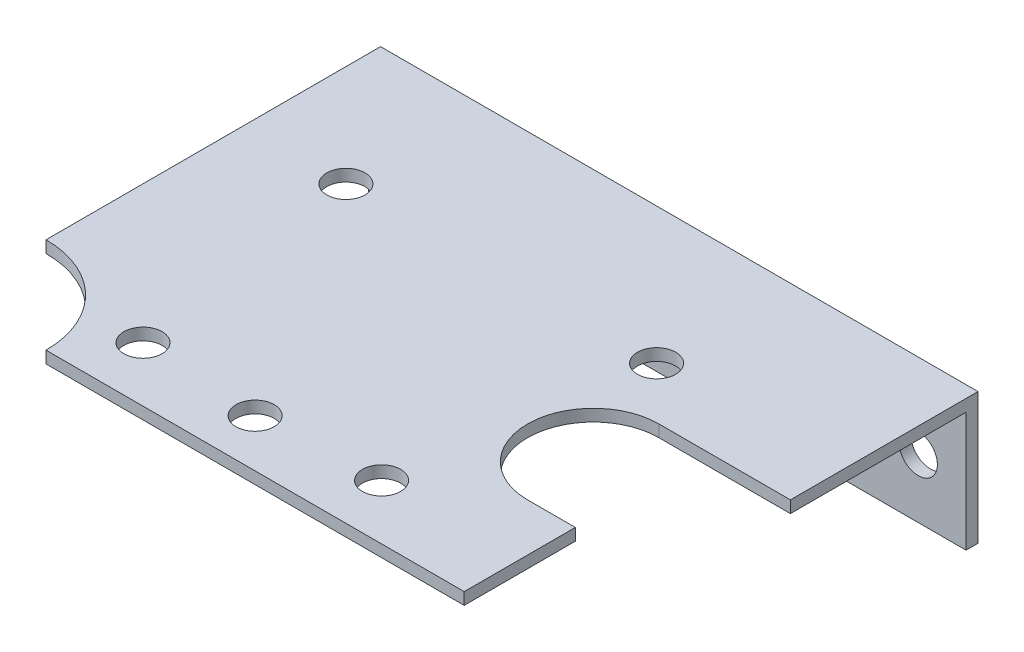
ISO-10303-21;
HEADER;
FILE_DESCRIPTION(('STEP AP214'),'2;1');
FILE_NAME('part.step','',(''),(''),'','','');
FILE_SCHEMA(('AUTOMOTIVE_DESIGN { 1 0 10303 214 1 1 1 1 }'));
ENDSEC;
DATA;
#1=APPLICATION_CONTEXT('core data for automotive mechanical design processes');
#2=APPLICATION_PROTOCOL_DEFINITION('international standard','automotive_design',2000,#1);
#3=PRODUCT_CONTEXT('',#1,'mechanical');
#4=PRODUCT('Part','Part','',(#3));
#5=PRODUCT_RELATED_PRODUCT_CATEGORY('part','',(#4));
#6=PRODUCT_DEFINITION_FORMATION('','',#4);
#7=PRODUCT_DEFINITION_CONTEXT('part definition',#1,'design');
#8=PRODUCT_DEFINITION('design','',#6,#7);
#9=PRODUCT_DEFINITION_SHAPE('','',#8);
#10=(LENGTH_UNIT() NAMED_UNIT(*) SI_UNIT(.MILLI.,.METRE.));
#11=(NAMED_UNIT(*) PLANE_ANGLE_UNIT() SI_UNIT($,.RADIAN.));
#12=(NAMED_UNIT(*) SI_UNIT($,.STERADIAN.) SOLID_ANGLE_UNIT());
#13=UNCERTAINTY_MEASURE_WITH_UNIT(LENGTH_MEASURE(1.E-05),#10,'distance_accuracy_value','');
#14=(GEOMETRIC_REPRESENTATION_CONTEXT(3) GLOBAL_UNCERTAINTY_ASSIGNED_CONTEXT((#13)) GLOBAL_UNIT_ASSIGNED_CONTEXT((#10,
#11,#12)) REPRESENTATION_CONTEXT('',''));
#15=CARTESIAN_POINT('',(0.,0.,0.));
#16=DIRECTION('',(0.,0.,1.));
#17=DIRECTION('',(1.,0.,0.));
#18=AXIS2_PLACEMENT_3D('',#15,#16,#17);
#19=CARTESIAN_POINT('',(0.,1.,0.));
#20=DIRECTION('',(0.,1.,0.));
#21=DIRECTION('',(0.,0.,1.));
#22=AXIS2_PLACEMENT_3D('',#19,#20,#21);
#23=PLANE('',#22);
#24=DIRECTION('',(0.,0.,-1.));
#25=VECTOR('',#24,1.);
#26=CARTESIAN_POINT('',(50.,1.,-20.3));
#27=LINE('',#26,#25);
#28=CARTESIAN_POINT('',(50.,1.,-20.3));
#29=VERTEX_POINT('',#28);
#30=CARTESIAN_POINT('',(50.,1.,-36.));
#31=VERTEX_POINT('',#30);
#32=EDGE_CURVE('E95',#29,#31,#27,.T.);
#33=ORIENTED_EDGE('',*,*,#32,.T.);
#34=DIRECTION('',(-1.,0.,0.));
#35=VECTOR('',#34,1.);
#36=CARTESIAN_POINT('',(0.,1.,-36.));
#37=LINE('',#36,#35);
#38=CARTESIAN_POINT('',(0.,1.,-36.));
#39=VERTEX_POINT('',#38);
#40=EDGE_CURVE('E237',#31,#39,#37,.T.);
#41=ORIENTED_EDGE('',*,*,#40,.T.);
#42=DIRECTION('',(0.,0.,1.));
#43=VECTOR('',#42,1.);
#44=CARTESIAN_POINT('',(0.,1.,-8.));
#45=LINE('',#44,#43);
#46=CARTESIAN_POINT('',(0.,1.,-8.));
#47=VERTEX_POINT('',#46);
#48=EDGE_CURVE('E181',#39,#47,#45,.T.);
#49=ORIENTED_EDGE('',*,*,#48,.T.);
#50=CARTESIAN_POINT('',(0.,1.,0.));
#51=DIRECTION('',(0.,-1.,0.));
#52=DIRECTION('',(0.,0.,1.));
#53=AXIS2_PLACEMENT_3D('',#50,#51,#52);
#54=CIRCLE('',#53,8.);
#55=CARTESIAN_POINT('',(8.,1.,0.));
#56=VERTEX_POINT('',#55);
#57=EDGE_CURVE('E240',#47,#56,#54,.T.);
#58=ORIENTED_EDGE('',*,*,#57,.T.);
#59=DIRECTION('',(1.,0.,0.));
#60=VECTOR('',#59,1.);
#61=CARTESIAN_POINT('',(8.,1.,0.));
#62=LINE('',#61,#60);
#63=CARTESIAN_POINT('',(43.,1.,0.));
#64=VERTEX_POINT('',#63);
#65=EDGE_CURVE('E242',#56,#64,#62,.T.);
#66=ORIENTED_EDGE('',*,*,#65,.T.);
#67=DIRECTION('',(0.,0.,-1.));
#68=VECTOR('',#67,1.);
#69=CARTESIAN_POINT('',(43.,1.,0.));
#70=LINE('',#69,#68);
#71=CARTESIAN_POINT('',(43.,1.,-9.3));
#72=VERTEX_POINT('',#71);
#73=EDGE_CURVE('E121',#64,#72,#70,.T.);
#74=ORIENTED_EDGE('',*,*,#73,.T.);
#75=DIRECTION('',(-1.,0.,0.));
#76=VECTOR('',#75,1.);
#77=CARTESIAN_POINT('',(39.,1.,-9.3));
#78=LINE('',#77,#76);
#79=CARTESIAN_POINT('',(39.,1.,-9.3));
#80=VERTEX_POINT('',#79);
#81=EDGE_CURVE('E114',#72,#80,#78,.T.);
#82=ORIENTED_EDGE('',*,*,#81,.T.);
#83=CARTESIAN_POINT('',(39.,1.,-14.8));
#84=DIRECTION('',(0.,-1.,0.));
#85=DIRECTION('',(0.,0.,-1.));
#86=AXIS2_PLACEMENT_3D('',#83,#84,#85);
#87=CIRCLE('',#86,5.5);
#88=CARTESIAN_POINT('',(39.,1.,-20.3));
#89=VERTEX_POINT('',#88);
#90=EDGE_CURVE('E118',#80,#89,#87,.T.);
#91=ORIENTED_EDGE('',*,*,#90,.T.);
#92=DIRECTION('',(1.,0.,0.));
#93=VECTOR('',#92,1.);
#94=CARTESIAN_POINT('',(39.,1.,-20.3));
#95=LINE('',#94,#93);
#96=EDGE_CURVE('E59',#89,#29,#95,.T.);
#97=ORIENTED_EDGE('',*,*,#96,.T.);
#98=EDGE_LOOP('',(#33,#41,#49,#58,#66,#74,#82,#91,#97));
#99=FACE_BOUND('',#98,.T.);
#100=CARTESIAN_POINT('',(31.4819837707742,1.,-4.6));
#101=DIRECTION('',(0.,1.,0.));
#102=DIRECTION('',(0.,0.,1.));
#103=AXIS2_PLACEMENT_3D('',#100,#101,#102);
#104=CIRCLE('',#103,1.60000000000001);
#105=CARTESIAN_POINT('',(31.4819837707742,1.,-2.99999999999998));
#106=VERTEX_POINT('',#105);
#107=EDGE_CURVE('E214',#106,#106,#104,.T.);
#108=ORIENTED_EDGE('',*,*,#107,.F.);
#109=EDGE_LOOP('',(#108));
#110=FACE_BOUND('',#109,.T.);
#111=CARTESIAN_POINT('',(21.5,1.,-4.));
#112=DIRECTION('',(0.,1.,0.));
#113=DIRECTION('',(0.,0.,1.));
#114=AXIS2_PLACEMENT_3D('',#111,#112,#113);
#115=CIRCLE('',#114,1.6);
#116=CARTESIAN_POINT('',(21.5,1.,-2.4));
#117=VERTEX_POINT('',#116);
#118=EDGE_CURVE('E226',#117,#117,#115,.T.);
#119=ORIENTED_EDGE('',*,*,#118,.F.);
#120=EDGE_LOOP('',(#119));
#121=FACE_BOUND('',#120,.T.);
#122=CARTESIAN_POINT('',(8.5,1.,-24.6));
#123=DIRECTION('',(0.,1.,0.));
#124=DIRECTION('',(0.,0.,1.));
#125=AXIS2_PLACEMENT_3D('',#122,#123,#124);
#126=CIRCLE('',#125,1.6);
#127=CARTESIAN_POINT('',(8.5,1.,-23.));
#128=VERTEX_POINT('',#127);
#129=EDGE_CURVE('E146',#128,#128,#126,.T.);
#130=ORIENTED_EDGE('',*,*,#129,.F.);
#131=EDGE_LOOP('',(#130));
#132=FACE_BOUND('',#131,.T.);
#133=CARTESIAN_POINT('',(34.5,1.,-24.6));
#134=DIRECTION('',(0.,1.,0.));
#135=DIRECTION('',(0.,0.,-1.));
#136=AXIS2_PLACEMENT_3D('',#133,#134,#135);
#137=CIRCLE('',#136,1.6);
#138=CARTESIAN_POINT('',(34.5,1.,-26.2));
#139=VERTEX_POINT('',#138);
#140=EDGE_CURVE('E220',#139,#139,#137,.T.);
#141=ORIENTED_EDGE('',*,*,#140,.F.);
#142=EDGE_LOOP('',(#141));
#143=FACE_BOUND('',#142,.T.);
#144=CARTESIAN_POINT('',(11.5180162292258,1.,-4.59999999999999));
#145=DIRECTION('',(0.,1.,0.));
#146=DIRECTION('',(0.,0.,-1.));
#147=AXIS2_PLACEMENT_3D('',#144,#145,#146);
#148=CIRCLE('',#147,1.6);
#149=CARTESIAN_POINT('',(11.5180162292258,1.,-6.2));
#150=VERTEX_POINT('',#149);
#151=EDGE_CURVE('E208',#150,#150,#148,.T.);
#152=ORIENTED_EDGE('',*,*,#151,.F.);
#153=EDGE_LOOP('',(#152));
#154=FACE_BOUND('',#153,.T.);
#155=ADVANCED_FACE('F35',(#99,#110,#121,#132,#143,#154),#23,.T.);
#156=CARTESIAN_POINT('',(0.,0.,0.));
#157=DIRECTION('',(0.,1.,0.));
#158=DIRECTION('',(0.,0.,1.));
#159=AXIS2_PLACEMENT_3D('',#156,#157,#158);
#160=PLANE('',#159);
#161=DIRECTION('',(0.,0.,1.));
#162=VECTOR('',#161,1.);
#163=CARTESIAN_POINT('',(0.,0.,-8.));
#164=LINE('',#163,#162);
#165=CARTESIAN_POINT('',(0.,0.,-35.));
#166=VERTEX_POINT('',#165);
#167=CARTESIAN_POINT('',(0.,0.,-8.));
#168=VERTEX_POINT('',#167);
#169=EDGE_CURVE('E145',#166,#168,#164,.T.);
#170=ORIENTED_EDGE('',*,*,#169,.F.);
#171=DIRECTION('',(1.,0.,0.));
#172=VECTOR('',#171,1.);
#173=CARTESIAN_POINT('',(0.,0.,-35.));
#174=LINE('',#173,#172);
#175=CARTESIAN_POINT('',(50.,0.,-35.));
#176=VERTEX_POINT('',#175);
#177=EDGE_CURVE('E204',#166,#176,#174,.T.);
#178=ORIENTED_EDGE('',*,*,#177,.T.);
#179=DIRECTION('',(0.,0.,-1.));
#180=VECTOR('',#179,1.);
#181=CARTESIAN_POINT('',(50.,0.,-20.3));
#182=LINE('',#181,#180);
#183=CARTESIAN_POINT('',(50.,0.,-20.3));
#184=VERTEX_POINT('',#183);
#185=EDGE_CURVE('E142',#184,#176,#182,.T.);
#186=ORIENTED_EDGE('',*,*,#185,.F.);
#187=DIRECTION('',(1.,0.,0.));
#188=VECTOR('',#187,1.);
#189=CARTESIAN_POINT('',(39.,0.,-20.3));
#190=LINE('',#189,#188);
#191=CARTESIAN_POINT('',(39.,0.,-20.3));
#192=VERTEX_POINT('',#191);
#193=EDGE_CURVE('E89',#192,#184,#190,.T.);
#194=ORIENTED_EDGE('',*,*,#193,.F.);
#195=CARTESIAN_POINT('',(39.,0.,-14.8));
#196=DIRECTION('',(0.,-1.,0.));
#197=DIRECTION('',(0.,0.,-1.));
#198=AXIS2_PLACEMENT_3D('',#195,#196,#197);
#199=CIRCLE('',#198,5.5);
#200=CARTESIAN_POINT('',(39.,0.,-9.3));
#201=VERTEX_POINT('',#200);
#202=EDGE_CURVE('E155',#201,#192,#199,.T.);
#203=ORIENTED_EDGE('',*,*,#202,.F.);
#204=DIRECTION('',(-1.,0.,0.));
#205=VECTOR('',#204,1.);
#206=CARTESIAN_POINT('',(39.,0.,-9.3));
#207=LINE('',#206,#205);
#208=CARTESIAN_POINT('',(43.,0.,-9.3));
#209=VERTEX_POINT('',#208);
#210=EDGE_CURVE('E130',#209,#201,#207,.T.);
#211=ORIENTED_EDGE('',*,*,#210,.F.);
#212=DIRECTION('',(0.,0.,-1.));
#213=VECTOR('',#212,1.);
#214=CARTESIAN_POINT('',(43.,0.,0.));
#215=LINE('',#214,#213);
#216=CARTESIAN_POINT('',(43.,0.,0.));
#217=VERTEX_POINT('',#216);
#218=EDGE_CURVE('E152',#217,#209,#215,.T.);
#219=ORIENTED_EDGE('',*,*,#218,.F.);
#220=DIRECTION('',(1.,0.,0.));
#221=VECTOR('',#220,1.);
#222=CARTESIAN_POINT('',(8.,0.,0.));
#223=LINE('',#222,#221);
#224=CARTESIAN_POINT('',(8.,0.,0.));
#225=VERTEX_POINT('',#224);
#226=EDGE_CURVE('E150',#225,#217,#223,.T.);
#227=ORIENTED_EDGE('',*,*,#226,.F.);
#228=CARTESIAN_POINT('',(0.,0.,0.));
#229=DIRECTION('',(0.,-1.,0.));
#230=DIRECTION('',(0.,0.,1.));
#231=AXIS2_PLACEMENT_3D('',#228,#229,#230);
#232=CIRCLE('',#231,8.);
#233=EDGE_CURVE('E148',#168,#225,#232,.T.);
#234=ORIENTED_EDGE('',*,*,#233,.F.);
#235=EDGE_LOOP('',(#170,#178,#186,#194,#203,#211,#219,#227,#234));
#236=FACE_BOUND('',#235,.T.);
#237=CARTESIAN_POINT('',(8.5,0.,-24.6));
#238=DIRECTION('',(0.,1.,0.));
#239=DIRECTION('',(0.,0.,1.));
#240=AXIS2_PLACEMENT_3D('',#237,#238,#239);
#241=CIRCLE('',#240,1.6);
#242=CARTESIAN_POINT('',(8.5,0.,-23.));
#243=VERTEX_POINT('',#242);
#244=EDGE_CURVE('E229',#243,#243,#241,.T.);
#245=ORIENTED_EDGE('',*,*,#244,.T.);
#246=EDGE_LOOP('',(#245));
#247=FACE_BOUND('',#246,.T.);
#248=CARTESIAN_POINT('',(21.5,0.,-4.));
#249=DIRECTION('',(0.,1.,0.));
#250=DIRECTION('',(0.,0.,1.));
#251=AXIS2_PLACEMENT_3D('',#248,#249,#250);
#252=CIRCLE('',#251,1.6);
#253=CARTESIAN_POINT('',(21.5,0.,-2.4));
#254=VERTEX_POINT('',#253);
#255=EDGE_CURVE('E223',#254,#254,#252,.T.);
#256=ORIENTED_EDGE('',*,*,#255,.T.);
#257=EDGE_LOOP('',(#256));
#258=FACE_BOUND('',#257,.T.);
#259=CARTESIAN_POINT('',(34.5,0.,-24.6));
#260=DIRECTION('',(0.,1.,0.));
#261=DIRECTION('',(0.,0.,-1.));
#262=AXIS2_PLACEMENT_3D('',#259,#260,#261);
#263=CIRCLE('',#262,1.6);
#264=CARTESIAN_POINT('',(34.5,0.,-26.2));
#265=VERTEX_POINT('',#264);
#266=EDGE_CURVE('E217',#265,#265,#263,.T.);
#267=ORIENTED_EDGE('',*,*,#266,.T.);
#268=EDGE_LOOP('',(#267));
#269=FACE_BOUND('',#268,.T.);
#270=CARTESIAN_POINT('',(31.4819837707742,0.,-4.6));
#271=DIRECTION('',(0.,1.,0.));
#272=DIRECTION('',(0.,0.,1.));
#273=AXIS2_PLACEMENT_3D('',#270,#271,#272);
#274=CIRCLE('',#273,1.60000000000001);
#275=CARTESIAN_POINT('',(31.4819837707742,0.,-2.99999999999998));
#276=VERTEX_POINT('',#275);
#277=EDGE_CURVE('E211',#276,#276,#274,.T.);
#278=ORIENTED_EDGE('',*,*,#277,.T.);
#279=EDGE_LOOP('',(#278));
#280=FACE_BOUND('',#279,.T.);
#281=CARTESIAN_POINT('',(11.5180162292258,0.,-4.59999999999999));
#282=DIRECTION('',(0.,1.,0.));
#283=DIRECTION('',(0.,0.,-1.));
#284=AXIS2_PLACEMENT_3D('',#281,#282,#283);
#285=CIRCLE('',#284,1.6);
#286=CARTESIAN_POINT('',(11.5180162292258,0.,-6.2));
#287=VERTEX_POINT('',#286);
#288=EDGE_CURVE('E207',#287,#287,#285,.T.);
#289=ORIENTED_EDGE('',*,*,#288,.T.);
#290=EDGE_LOOP('',(#289));
#291=FACE_BOUND('',#290,.T.);
#292=ADVANCED_FACE('F255',(#236,#247,#258,#269,#280,#291),#160,.F.);
#293=CARTESIAN_POINT('',(50.,1.,-20.3));
#294=DIRECTION('',(-1.,0.,0.));
#295=DIRECTION('',(0.,0.,1.));
#296=AXIS2_PLACEMENT_3D('',#293,#294,#295);
#297=PLANE('',#296);
#298=ORIENTED_EDGE('',*,*,#185,.T.);
#299=DIRECTION('',(0.,1.,0.));
#300=VECTOR('',#299,1.);
#301=CARTESIAN_POINT('',(50.,-10.,-35.));
#302=LINE('',#301,#300);
#303=CARTESIAN_POINT('',(50.,-10.,-35.));
#304=VERTEX_POINT('',#303);
#305=EDGE_CURVE('E50',#304,#176,#302,.T.);
#306=ORIENTED_EDGE('',*,*,#305,.F.);
#307=DIRECTION('',(0.,0.,-1.));
#308=VECTOR('',#307,1.);
#309=CARTESIAN_POINT('',(50.,-10.,-36.));
#310=LINE('',#309,#308);
#311=CARTESIAN_POINT('',(50.,-10.,-36.));
#312=VERTEX_POINT('',#311);
#313=EDGE_CURVE('E198',#304,#312,#310,.T.);
#314=ORIENTED_EDGE('',*,*,#313,.T.);
#315=DIRECTION('',(0.,-1.,0.));
#316=VECTOR('',#315,1.);
#317=CARTESIAN_POINT('',(50.,1.,-36.));
#318=LINE('',#317,#316);
#319=EDGE_CURVE('E11',#31,#312,#318,.T.);
#320=ORIENTED_EDGE('',*,*,#319,.F.);
#321=ORIENTED_EDGE('',*,*,#32,.F.);
#322=DIRECTION('',(0.,-1.,0.));
#323=VECTOR('',#322,1.);
#324=CARTESIAN_POINT('',(50.,1.,-20.3));
#325=LINE('',#324,#323);
#326=EDGE_CURVE('E138',#29,#184,#325,.T.);
#327=ORIENTED_EDGE('',*,*,#326,.T.);
#328=EDGE_LOOP('',(#298,#306,#314,#320,#321,#327));
#329=FACE_BOUND('',#328,.T.);
#330=ADVANCED_FACE('F37',(#329),#297,.F.);
#331=CARTESIAN_POINT('',(0.,1.,-36.));
#332=DIRECTION('',(0.,0.,1.));
#333=DIRECTION('',(1.,0.,0.));
#334=AXIS2_PLACEMENT_3D('',#331,#332,#333);
#335=PLANE('',#334);
#336=CARTESIAN_POINT('',(46.,-5.,-36.));
#337=DIRECTION('',(0.,0.,1.));
#338=DIRECTION('',(1.,0.,0.));
#339=AXIS2_PLACEMENT_3D('',#336,#337,#338);
#340=CIRCLE('',#339,1.6);
#341=CARTESIAN_POINT('',(47.6,-5.,-36.));
#342=VERTEX_POINT('',#341);
#343=EDGE_CURVE('E192',#342,#342,#340,.T.);
#344=ORIENTED_EDGE('',*,*,#343,.T.);
#345=EDGE_LOOP('',(#344));
#346=FACE_BOUND('',#345,.T.);
#347=CARTESIAN_POINT('',(18.,-5.,-36.));
#348=DIRECTION('',(0.,0.,1.));
#349=DIRECTION('',(1.,0.,0.));
#350=AXIS2_PLACEMENT_3D('',#347,#348,#349);
#351=CIRCLE('',#350,1.6);
#352=CARTESIAN_POINT('',(19.6,-5.,-36.));
#353=VERTEX_POINT('',#352);
#354=EDGE_CURVE('E268',#353,#353,#351,.T.);
#355=ORIENTED_EDGE('',*,*,#354,.T.);
#356=EDGE_LOOP('',(#355));
#357=FACE_BOUND('',#356,.T.);
#358=ORIENTED_EDGE('',*,*,#319,.T.);
#359=DIRECTION('',(-1.,0.,0.));
#360=VECTOR('',#359,1.);
#361=CARTESIAN_POINT('',(0.,-10.,-36.));
#362=LINE('',#361,#360);
#363=CARTESIAN_POINT('',(0.,-10.,-36.));
#364=VERTEX_POINT('',#363);
#365=EDGE_CURVE('E190',#312,#364,#362,.T.);
#366=ORIENTED_EDGE('',*,*,#365,.T.);
#367=DIRECTION('',(0.,-1.,0.));
#368=VECTOR('',#367,1.);
#369=CARTESIAN_POINT('',(0.,1.,-36.));
#370=LINE('',#369,#368);
#371=EDGE_CURVE('E43',#39,#364,#370,.T.);
#372=ORIENTED_EDGE('',*,*,#371,.F.);
#373=ORIENTED_EDGE('',*,*,#40,.F.);
#374=EDGE_LOOP('',(#358,#366,#372,#373));
#375=FACE_BOUND('',#374,.T.);
#376=ADVANCED_FACE('F194',(#346,#357,#375),#335,.F.);
#377=CARTESIAN_POINT('',(0.,1.,-8.));
#378=DIRECTION('',(1.,0.,0.));
#379=DIRECTION('',(0.,0.,-1.));
#380=AXIS2_PLACEMENT_3D('',#377,#378,#379);
#381=PLANE('',#380);
#382=DIRECTION('',(0.,-1.,0.));
#383=VECTOR('',#382,1.);
#384=CARTESIAN_POINT('',(0.,1.,-8.));
#385=LINE('',#384,#383);
#386=EDGE_CURVE('E167',#47,#168,#385,.T.);
#387=ORIENTED_EDGE('',*,*,#386,.F.);
#388=ORIENTED_EDGE('',*,*,#48,.F.);
#389=ORIENTED_EDGE('',*,*,#371,.T.);
#390=DIRECTION('',(0.,0.,1.));
#391=VECTOR('',#390,1.);
#392=CARTESIAN_POINT('',(0.,-10.,-36.));
#393=LINE('',#392,#391);
#394=CARTESIAN_POINT('',(0.,-10.,-35.));
#395=VERTEX_POINT('',#394);
#396=EDGE_CURVE('E180',#364,#395,#393,.T.);
#397=ORIENTED_EDGE('',*,*,#396,.T.);
#398=DIRECTION('',(0.,1.,0.));
#399=VECTOR('',#398,1.);
#400=CARTESIAN_POINT('',(0.,-10.,-35.));
#401=LINE('',#400,#399);
#402=EDGE_CURVE('E197',#395,#166,#401,.T.);
#403=ORIENTED_EDGE('',*,*,#402,.T.);
#404=ORIENTED_EDGE('',*,*,#169,.T.);
#405=EDGE_LOOP('',(#387,#388,#389,#397,#403,#404));
#406=FACE_BOUND('',#405,.T.);
#407=ADVANCED_FACE('F177',(#406),#381,.F.);
#408=CARTESIAN_POINT('',(0.,1.,0.));
#409=DIRECTION('',(0.,-1.,0.));
#410=DIRECTION('',(0.,0.,-1.));
#411=AXIS2_PLACEMENT_3D('',#408,#409,#410);
#412=CYLINDRICAL_SURFACE('',#411,8.);
#413=ORIENTED_EDGE('',*,*,#233,.T.);
#414=DIRECTION('',(0.,-1.,0.));
#415=VECTOR('',#414,1.);
#416=CARTESIAN_POINT('',(8.,1.,0.));
#417=LINE('',#416,#415);
#418=EDGE_CURVE('E164',#56,#225,#417,.T.);
#419=ORIENTED_EDGE('',*,*,#418,.F.);
#420=ORIENTED_EDGE('',*,*,#57,.F.);
#421=ORIENTED_EDGE('',*,*,#386,.T.);
#422=EDGE_LOOP('',(#413,#419,#420,#421));
#423=FACE_BOUND('',#422,.T.);
#424=ADVANCED_FACE('F299',(#423),#412,.F.);
#425=CARTESIAN_POINT('',(8.,1.,0.));
#426=DIRECTION('',(0.,0.,-1.));
#427=DIRECTION('',(-1.,0.,0.));
#428=AXIS2_PLACEMENT_3D('',#425,#426,#427);
#429=PLANE('',#428);
#430=ORIENTED_EDGE('',*,*,#226,.T.);
#431=DIRECTION('',(0.,-1.,0.));
#432=VECTOR('',#431,1.);
#433=CARTESIAN_POINT('',(43.,1.,0.));
#434=LINE('',#433,#432);
#435=EDGE_CURVE('E161',#64,#217,#434,.T.);
#436=ORIENTED_EDGE('',*,*,#435,.F.);
#437=ORIENTED_EDGE('',*,*,#65,.F.);
#438=ORIENTED_EDGE('',*,*,#418,.T.);
#439=EDGE_LOOP('',(#430,#436,#437,#438));
#440=FACE_BOUND('',#439,.T.);
#441=ADVANCED_FACE('F248',(#440),#429,.F.);
#442=CARTESIAN_POINT('',(43.,1.,0.));
#443=DIRECTION('',(-1.,0.,0.));
#444=DIRECTION('',(0.,0.,1.));
#445=AXIS2_PLACEMENT_3D('',#442,#443,#444);
#446=PLANE('',#445);
#447=ORIENTED_EDGE('',*,*,#218,.T.);
#448=DIRECTION('',(0.,-1.,0.));
#449=VECTOR('',#448,1.);
#450=CARTESIAN_POINT('',(43.,1.,-9.3));
#451=LINE('',#450,#449);
#452=EDGE_CURVE('E133',#72,#209,#451,.T.);
#453=ORIENTED_EDGE('',*,*,#452,.F.);
#454=ORIENTED_EDGE('',*,*,#73,.F.);
#455=ORIENTED_EDGE('',*,*,#435,.T.);
#456=EDGE_LOOP('',(#447,#453,#454,#455));
#457=FACE_BOUND('',#456,.T.);
#458=ADVANCED_FACE('F252',(#457),#446,.F.);
#459=CARTESIAN_POINT('',(39.,1.,-9.3));
#460=DIRECTION('',(0.,0.,1.));
#461=DIRECTION('',(1.,0.,0.));
#462=AXIS2_PLACEMENT_3D('',#459,#460,#461);
#463=PLANE('',#462);
#464=ORIENTED_EDGE('',*,*,#210,.T.);
#465=DIRECTION('',(0.,-1.,0.));
#466=VECTOR('',#465,1.);
#467=CARTESIAN_POINT('',(39.,1.,-9.3));
#468=LINE('',#467,#466);
#469=EDGE_CURVE('E127',#80,#201,#468,.T.);
#470=ORIENTED_EDGE('',*,*,#469,.F.);
#471=ORIENTED_EDGE('',*,*,#81,.F.);
#472=ORIENTED_EDGE('',*,*,#452,.T.);
#473=EDGE_LOOP('',(#464,#470,#471,#472));
#474=FACE_BOUND('',#473,.T.);
#475=ADVANCED_FACE('F128',(#474),#463,.F.);
#476=CARTESIAN_POINT('',(39.,1.,-14.8));
#477=DIRECTION('',(0.,-1.,0.));
#478=DIRECTION('',(0.,0.,-1.));
#479=AXIS2_PLACEMENT_3D('',#476,#477,#478);
#480=CYLINDRICAL_SURFACE('',#479,5.5);
#481=ORIENTED_EDGE('',*,*,#202,.T.);
#482=DIRECTION('',(0.,-1.,0.));
#483=VECTOR('',#482,1.);
#484=CARTESIAN_POINT('',(39.,1.,-20.3));
#485=LINE('',#484,#483);
#486=EDGE_CURVE('E134',#89,#192,#485,.T.);
#487=ORIENTED_EDGE('',*,*,#486,.F.);
#488=ORIENTED_EDGE('',*,*,#90,.F.);
#489=ORIENTED_EDGE('',*,*,#469,.T.);
#490=EDGE_LOOP('',(#481,#487,#488,#489));
#491=FACE_BOUND('',#490,.T.);
#492=ADVANCED_FACE('F136',(#491),#480,.F.);
#493=CARTESIAN_POINT('',(39.,1.,-20.3));
#494=DIRECTION('',(0.,0.,-1.));
#495=DIRECTION('',(-1.,0.,0.));
#496=AXIS2_PLACEMENT_3D('',#493,#494,#495);
#497=PLANE('',#496);
#498=ORIENTED_EDGE('',*,*,#193,.T.);
#499=ORIENTED_EDGE('',*,*,#326,.F.);
#500=ORIENTED_EDGE('',*,*,#96,.F.);
#501=ORIENTED_EDGE('',*,*,#486,.T.);
#502=EDGE_LOOP('',(#498,#499,#500,#501));
#503=FACE_BOUND('',#502,.T.);
#504=ADVANCED_FACE('F258',(#503),#497,.F.);
#505=CARTESIAN_POINT('',(8.5,1.,-24.6));
#506=DIRECTION('',(0.,-1.,0.));
#507=DIRECTION('',(0.,0.,-1.));
#508=AXIS2_PLACEMENT_3D('',#505,#506,#507);
#509=CYLINDRICAL_SURFACE('',#508,1.6);
#510=ORIENTED_EDGE('',*,*,#129,.T.);
#511=EDGE_LOOP('',(#510));
#512=FACE_BOUND('',#511,.T.);
#513=ORIENTED_EDGE('',*,*,#244,.F.);
#514=EDGE_LOOP('',(#513));
#515=FACE_BOUND('',#514,.T.);
#516=ADVANCED_FACE('F308',(#512,#515),#509,.F.);
#517=CARTESIAN_POINT('',(21.5,1.,-4.));
#518=DIRECTION('',(0.,-1.,0.));
#519=DIRECTION('',(0.,0.,-1.));
#520=AXIS2_PLACEMENT_3D('',#517,#518,#519);
#521=CYLINDRICAL_SURFACE('',#520,1.6);
#522=ORIENTED_EDGE('',*,*,#118,.T.);
#523=EDGE_LOOP('',(#522));
#524=FACE_BOUND('',#523,.T.);
#525=ORIENTED_EDGE('',*,*,#255,.F.);
#526=EDGE_LOOP('',(#525));
#527=FACE_BOUND('',#526,.T.);
#528=ADVANCED_FACE('F354',(#524,#527),#521,.F.);
#529=CARTESIAN_POINT('',(34.5,1.,-24.6));
#530=DIRECTION('',(0.,-1.,0.));
#531=DIRECTION('',(0.,0.,-1.));
#532=AXIS2_PLACEMENT_3D('',#529,#530,#531);
#533=CYLINDRICAL_SURFACE('',#532,1.6);
#534=ORIENTED_EDGE('',*,*,#140,.T.);
#535=EDGE_LOOP('',(#534));
#536=FACE_BOUND('',#535,.T.);
#537=ORIENTED_EDGE('',*,*,#266,.F.);
#538=EDGE_LOOP('',(#537));
#539=FACE_BOUND('',#538,.T.);
#540=ADVANCED_FACE('F361',(#536,#539),#533,.F.);
#541=CARTESIAN_POINT('',(31.4819837707742,1.,-4.6));
#542=DIRECTION('',(0.,-1.,0.));
#543=DIRECTION('',(0.,0.,-1.));
#544=AXIS2_PLACEMENT_3D('',#541,#542,#543);
#545=CYLINDRICAL_SURFACE('',#544,1.60000000000001);
#546=ORIENTED_EDGE('',*,*,#107,.T.);
#547=EDGE_LOOP('',(#546));
#548=FACE_BOUND('',#547,.T.);
#549=ORIENTED_EDGE('',*,*,#277,.F.);
#550=EDGE_LOOP('',(#549));
#551=FACE_BOUND('',#550,.T.);
#552=ADVANCED_FACE('F368',(#548,#551),#545,.F.);
#553=CARTESIAN_POINT('',(11.5180162292258,1.,-4.59999999999999));
#554=DIRECTION('',(0.,-1.,0.));
#555=DIRECTION('',(0.,0.,-1.));
#556=AXIS2_PLACEMENT_3D('',#553,#554,#555);
#557=CYLINDRICAL_SURFACE('',#556,1.6);
#558=ORIENTED_EDGE('',*,*,#151,.T.);
#559=EDGE_LOOP('',(#558));
#560=FACE_BOUND('',#559,.T.);
#561=ORIENTED_EDGE('',*,*,#288,.F.);
#562=EDGE_LOOP('',(#561));
#563=FACE_BOUND('',#562,.T.);
#564=ADVANCED_FACE('F283',(#560,#563),#557,.F.);
#565=CARTESIAN_POINT('',(0.,-10.,-35.));
#566=DIRECTION('',(0.,0.,1.));
#567=DIRECTION('',(1.,0.,0.));
#568=AXIS2_PLACEMENT_3D('',#565,#566,#567);
#569=PLANE('',#568);
#570=CARTESIAN_POINT('',(46.,-5.,-35.));
#571=DIRECTION('',(0.,0.,1.));
#572=DIRECTION('',(1.,0.,0.));
#573=AXIS2_PLACEMENT_3D('',#570,#571,#572);
#574=CIRCLE('',#573,1.6);
#575=CARTESIAN_POINT('',(47.6,-5.,-35.));
#576=VERTEX_POINT('',#575);
#577=EDGE_CURVE('E271',#576,#576,#574,.T.);
#578=ORIENTED_EDGE('',*,*,#577,.F.);
#579=EDGE_LOOP('',(#578));
#580=FACE_BOUND('',#579,.T.);
#581=CARTESIAN_POINT('',(18.,-5.,-35.));
#582=DIRECTION('',(0.,0.,1.));
#583=DIRECTION('',(1.,0.,0.));
#584=AXIS2_PLACEMENT_3D('',#581,#582,#583);
#585=CIRCLE('',#584,1.6);
#586=CARTESIAN_POINT('',(19.6,-5.,-35.));
#587=VERTEX_POINT('',#586);
#588=EDGE_CURVE('E272',#587,#587,#585,.T.);
#589=ORIENTED_EDGE('',*,*,#588,.F.);
#590=EDGE_LOOP('',(#589));
#591=FACE_BOUND('',#590,.T.);
#592=ORIENTED_EDGE('',*,*,#177,.F.);
#593=ORIENTED_EDGE('',*,*,#402,.F.);
#594=DIRECTION('',(1.,0.,0.));
#595=VECTOR('',#594,1.);
#596=CARTESIAN_POINT('',(0.,-10.,-35.));
#597=LINE('',#596,#595);
#598=EDGE_CURVE('E191',#395,#304,#597,.T.);
#599=ORIENTED_EDGE('',*,*,#598,.T.);
#600=ORIENTED_EDGE('',*,*,#305,.T.);
#601=EDGE_LOOP('',(#592,#593,#599,#600));
#602=FACE_BOUND('',#601,.T.);
#603=ADVANCED_FACE('F264',(#580,#591,#602),#569,.T.);
#604=CARTESIAN_POINT('',(0.,-10.,0.));
#605=DIRECTION('',(0.,1.,0.));
#606=DIRECTION('',(0.,0.,1.));
#607=AXIS2_PLACEMENT_3D('',#604,#605,#606);
#608=PLANE('',#607);
#609=ORIENTED_EDGE('',*,*,#396,.F.);
#610=ORIENTED_EDGE('',*,*,#365,.F.);
#611=ORIENTED_EDGE('',*,*,#313,.F.);
#612=ORIENTED_EDGE('',*,*,#598,.F.);
#613=EDGE_LOOP('',(#609,#610,#611,#612));
#614=FACE_BOUND('',#613,.T.);
#615=ADVANCED_FACE('F188',(#614),#608,.F.);
#616=CARTESIAN_POINT('',(18.,-5.,-45.));
#617=DIRECTION('',(0.,0.,1.));
#618=DIRECTION('',(1.,0.,0.));
#619=AXIS2_PLACEMENT_3D('',#616,#617,#618);
#620=CYLINDRICAL_SURFACE('',#619,1.6);
#621=ORIENTED_EDGE('',*,*,#588,.T.);
#622=EDGE_LOOP('',(#621));
#623=FACE_BOUND('',#622,.T.);
#624=ORIENTED_EDGE('',*,*,#354,.F.);
#625=EDGE_LOOP('',(#624));
#626=FACE_BOUND('',#625,.T.);
#627=ADVANCED_FACE('F287',(#623,#626),#620,.F.);
#628=CARTESIAN_POINT('',(46.,-5.,-45.));
#629=DIRECTION('',(0.,0.,1.));
#630=DIRECTION('',(1.,0.,0.));
#631=AXIS2_PLACEMENT_3D('',#628,#629,#630);
#632=CYLINDRICAL_SURFACE('',#631,1.6);
#633=ORIENTED_EDGE('',*,*,#577,.T.);
#634=EDGE_LOOP('',(#633));
#635=FACE_BOUND('',#634,.T.);
#636=ORIENTED_EDGE('',*,*,#343,.F.);
#637=EDGE_LOOP('',(#636));
#638=FACE_BOUND('',#637,.T.);
#639=ADVANCED_FACE('F278',(#635,#638),#632,.F.);
#640=CLOSED_SHELL('',(#155,#292,#330,#376,#407,#424,#441,#458,#475,#492,#504,#516,#528,#540,
#552,#564,#603,#615,#627,#639));
#641=MANIFOLD_SOLID_BREP('B2',#640);
#642=ADVANCED_BREP_SHAPE_REPRESENTATION('',(#18,#641),#14);
#643=SHAPE_DEFINITION_REPRESENTATION(#9,#642);
ENDSEC;
END-ISO-10303-21;
